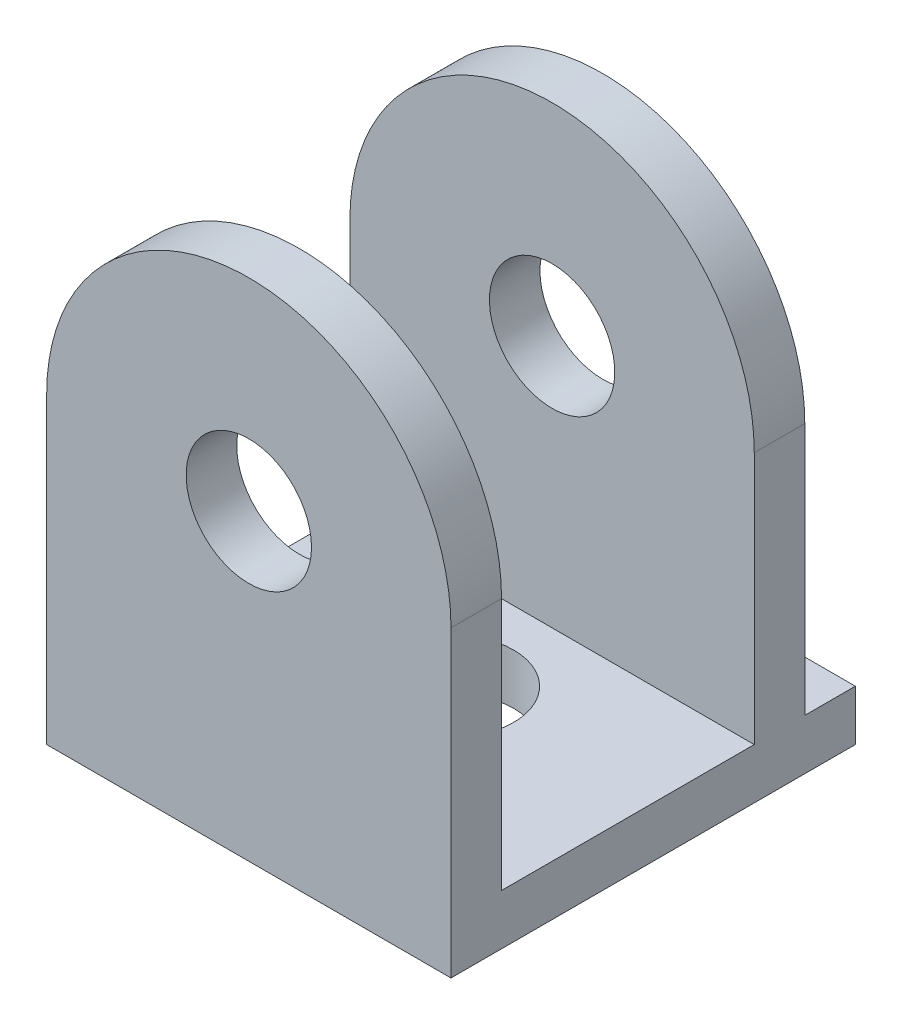
ISO-10303-21;
HEADER;
FILE_DESCRIPTION(('STEP AP214'),'2;1');
FILE_NAME('part.step','',(''),(''),'','','');
FILE_SCHEMA(('AUTOMOTIVE_DESIGN { 1 0 10303 214 1 1 1 1 }'));
ENDSEC;
DATA;
#1=APPLICATION_CONTEXT('core data for automotive mechanical design processes');
#2=APPLICATION_PROTOCOL_DEFINITION('international standard','automotive_design',2000,#1);
#3=PRODUCT_CONTEXT('',#1,'mechanical');
#4=PRODUCT('Part','Part','',(#3));
#5=PRODUCT_RELATED_PRODUCT_CATEGORY('part','',(#4));
#6=PRODUCT_DEFINITION_FORMATION('','',#4);
#7=PRODUCT_DEFINITION_CONTEXT('part definition',#1,'design');
#8=PRODUCT_DEFINITION('design','',#6,#7);
#9=PRODUCT_DEFINITION_SHAPE('','',#8);
#10=(LENGTH_UNIT() NAMED_UNIT(*) SI_UNIT(.MILLI.,.METRE.));
#11=(NAMED_UNIT(*) PLANE_ANGLE_UNIT() SI_UNIT($,.RADIAN.));
#12=(NAMED_UNIT(*) SI_UNIT($,.STERADIAN.) SOLID_ANGLE_UNIT());
#13=UNCERTAINTY_MEASURE_WITH_UNIT(LENGTH_MEASURE(1.E-05),#10,'distance_accuracy_value','');
#14=(GEOMETRIC_REPRESENTATION_CONTEXT(3) GLOBAL_UNCERTAINTY_ASSIGNED_CONTEXT((#13)) GLOBAL_UNIT_ASSIGNED_CONTEXT((#10,
#11,#12)) REPRESENTATION_CONTEXT('',''));
#15=CARTESIAN_POINT('',(0.,0.,0.));
#16=DIRECTION('',(0.,0.,1.));
#17=DIRECTION('',(1.,0.,0.));
#18=AXIS2_PLACEMENT_3D('',#15,#16,#17);
#19=CARTESIAN_POINT('',(0.,15.,10.));
#20=DIRECTION('',(0.,0.,-1.));
#21=DIRECTION('',(-1.,0.,0.));
#22=AXIS2_PLACEMENT_3D('',#19,#20,#21);
#23=CYLINDRICAL_SURFACE('',#22,10.);
#24=CARTESIAN_POINT('',(0.,15.,7.5));
#25=DIRECTION('',(0.,0.,1.));
#26=DIRECTION('',(0.,-1.,0.));
#27=AXIS2_PLACEMENT_3D('',#24,#25,#26);
#28=CIRCLE('',#27,10.);
#29=CARTESIAN_POINT('',(-10.,15.,7.5));
#30=VERTEX_POINT('',#29);
#31=CARTESIAN_POINT('',(10.,15.,7.5));
#32=VERTEX_POINT('',#31);
#33=EDGE_CURVE('E166',#30,#32,#28,.F.);
#34=ORIENTED_EDGE('',*,*,#33,.F.);
#35=DIRECTION('',(0.,0.,-1.));
#36=VECTOR('',#35,1.);
#37=CARTESIAN_POINT('',(-10.,15.,10.));
#38=LINE('',#37,#36);
#39=CARTESIAN_POINT('',(-10.,15.,10.));
#40=VERTEX_POINT('',#39);
#41=EDGE_CURVE('E49',#40,#30,#38,.T.);
#42=ORIENTED_EDGE('',*,*,#41,.F.);
#43=CARTESIAN_POINT('',(0.,15.,10.));
#44=DIRECTION('',(0.,0.,1.));
#45=DIRECTION('',(1.,0.,0.));
#46=AXIS2_PLACEMENT_3D('',#43,#44,#45);
#47=CIRCLE('',#46,10.);
#48=CARTESIAN_POINT('',(10.,15.,10.));
#49=VERTEX_POINT('',#48);
#50=EDGE_CURVE('E171',#40,#49,#47,.F.);
#51=ORIENTED_EDGE('',*,*,#50,.T.);
#52=DIRECTION('',(0.,0.,-1.));
#53=VECTOR('',#52,1.);
#54=CARTESIAN_POINT('',(10.,15.,10.));
#55=LINE('',#54,#53);
#56=EDGE_CURVE('E190',#49,#32,#55,.T.);
#57=ORIENTED_EDGE('',*,*,#56,.T.);
#58=EDGE_LOOP('',(#34,#42,#51,#57));
#59=FACE_BOUND('',#58,.T.);
#60=ADVANCED_FACE('F41',(#59),#23,.T.);
#61=CARTESIAN_POINT('',(0.,15.,-5.));
#62=DIRECTION('',(0.,0.,-1.));
#63=DIRECTION('',(0.,1.,0.));
#64=AXIS2_PLACEMENT_3D('',#61,#62,#63);
#65=CIRCLE('',#64,10.);
#66=CARTESIAN_POINT('',(10.,15.,-5.));
#67=VERTEX_POINT('',#66);
#68=CARTESIAN_POINT('',(-10.,15.,-5.));
#69=VERTEX_POINT('',#68);
#70=EDGE_CURVE('E168',#67,#69,#65,.F.);
#71=ORIENTED_EDGE('',*,*,#70,.F.);
#72=CARTESIAN_POINT('',(10.,15.,-7.50000000000001));
#73=VERTEX_POINT('',#72);
#74=EDGE_CURVE('E142',#67,#73,#55,.T.);
#75=ORIENTED_EDGE('',*,*,#74,.T.);
#76=CARTESIAN_POINT('',(0.,15.,-7.50000000000001));
#77=DIRECTION('',(0.,0.,1.));
#78=DIRECTION('',(0.,-1.,0.));
#79=AXIS2_PLACEMENT_3D('',#76,#77,#78);
#80=CIRCLE('',#79,10.);
#81=CARTESIAN_POINT('',(-10.,15.,-7.50000000000001));
#82=VERTEX_POINT('',#81);
#83=EDGE_CURVE('E126',#82,#73,#80,.F.);
#84=ORIENTED_EDGE('',*,*,#83,.F.);
#85=EDGE_CURVE('E198',#69,#82,#38,.T.);
#86=ORIENTED_EDGE('',*,*,#85,.F.);
#87=EDGE_LOOP('',(#71,#75,#84,#86));
#88=FACE_BOUND('',#87,.T.);
#89=ADVANCED_FACE('F43',(#88),#23,.T.);
#90=CARTESIAN_POINT('',(-10.,0.,10.));
#91=DIRECTION('',(1.,0.,0.));
#92=DIRECTION('',(0.,1.,0.));
#93=AXIS2_PLACEMENT_3D('',#90,#91,#92);
#94=PLANE('',#93);
#95=ORIENTED_EDGE('',*,*,#41,.T.);
#96=DIRECTION('',(0.,-1.,0.));
#97=VECTOR('',#96,1.);
#98=CARTESIAN_POINT('',(-10.,25.,7.5));
#99=LINE('',#98,#97);
#100=CARTESIAN_POINT('',(-10.,2.5,7.49999999999999));
#101=VERTEX_POINT('',#100);
#102=EDGE_CURVE('E145',#30,#101,#99,.T.);
#103=ORIENTED_EDGE('',*,*,#102,.T.);
#104=DIRECTION('',(0.,0.,-1.));
#105=VECTOR('',#104,1.);
#106=CARTESIAN_POINT('',(-10.,2.5,7.49999999999999));
#107=LINE('',#106,#105);
#108=CARTESIAN_POINT('',(-10.,2.5,-5.));
#109=VERTEX_POINT('',#108);
#110=EDGE_CURVE('E143',#101,#109,#107,.T.);
#111=ORIENTED_EDGE('',*,*,#110,.T.);
#112=DIRECTION('',(0.,1.,0.));
#113=VECTOR('',#112,1.);
#114=CARTESIAN_POINT('',(-10.,25.,-5.));
#115=LINE('',#114,#113);
#116=EDGE_CURVE('E130',#109,#69,#115,.T.);
#117=ORIENTED_EDGE('',*,*,#116,.T.);
#118=ORIENTED_EDGE('',*,*,#85,.T.);
#119=DIRECTION('',(0.,-1.,0.));
#120=VECTOR('',#119,1.);
#121=CARTESIAN_POINT('',(-10.,25.,-7.5));
#122=LINE('',#121,#120);
#123=CARTESIAN_POINT('',(-10.,2.49999999999999,-7.50000000000001));
#124=VERTEX_POINT('',#123);
#125=EDGE_CURVE('E158',#82,#124,#122,.T.);
#126=ORIENTED_EDGE('',*,*,#125,.T.);
#127=DIRECTION('',(0.,0.,-1.));
#128=VECTOR('',#127,1.);
#129=CARTESIAN_POINT('',(-10.,2.49999999999999,-10.));
#130=LINE('',#129,#128);
#131=CARTESIAN_POINT('',(-10.,2.49999999999999,-10.));
#132=VERTEX_POINT('',#131);
#133=EDGE_CURVE('E152',#124,#132,#130,.T.);
#134=ORIENTED_EDGE('',*,*,#133,.T.);
#135=DIRECTION('',(0.,-1.,0.));
#136=VECTOR('',#135,1.);
#137=CARTESIAN_POINT('',(-10.,0.,-10.));
#138=LINE('',#137,#136);
#139=CARTESIAN_POINT('',(-10.,0.,-10.));
#140=VERTEX_POINT('',#139);
#141=EDGE_CURVE('E167',#132,#140,#138,.T.);
#142=ORIENTED_EDGE('',*,*,#141,.T.);
#143=DIRECTION('',(0.,0.,-1.));
#144=VECTOR('',#143,1.);
#145=CARTESIAN_POINT('',(-10.,0.,10.));
#146=LINE('',#145,#144);
#147=CARTESIAN_POINT('',(-10.,0.,10.));
#148=VERTEX_POINT('',#147);
#149=EDGE_CURVE('E194',#148,#140,#146,.T.);
#150=ORIENTED_EDGE('',*,*,#149,.F.);
#151=DIRECTION('',(0.,-1.,0.));
#152=VECTOR('',#151,1.);
#153=CARTESIAN_POINT('',(-10.,0.,10.));
#154=LINE('',#153,#152);
#155=EDGE_CURVE('E172',#40,#148,#154,.T.);
#156=ORIENTED_EDGE('',*,*,#155,.F.);
#157=EDGE_LOOP('',(#95,#103,#111,#117,#118,#126,#134,#142,#150,#156));
#158=FACE_BOUND('',#157,.T.);
#159=ADVANCED_FACE('F234',(#158),#94,.F.);
#160=CARTESIAN_POINT('',(0.,0.,10.));
#161=DIRECTION('',(0.,1.,0.));
#162=DIRECTION('',(0.,0.,1.));
#163=AXIS2_PLACEMENT_3D('',#160,#161,#162);
#164=PLANE('',#163);
#165=CARTESIAN_POINT('',(0.,0.,0.));
#166=DIRECTION('',(0.,-1.,0.));
#167=DIRECTION('',(0.,0.,-1.));
#168=AXIS2_PLACEMENT_3D('',#165,#166,#167);
#169=CIRCLE('',#168,3.1);
#170=CARTESIAN_POINT('',(0.,0.,-3.1));
#171=VERTEX_POINT('',#170);
#172=EDGE_CURVE('E210',#171,#171,#169,.T.);
#173=ORIENTED_EDGE('',*,*,#172,.F.);
#174=EDGE_LOOP('',(#173));
#175=FACE_BOUND('',#174,.T.);
#176=DIRECTION('',(1.,0.,0.));
#177=VECTOR('',#176,1.);
#178=CARTESIAN_POINT('',(0.,0.,-10.));
#179=LINE('',#178,#177);
#180=CARTESIAN_POINT('',(10.,0.,-10.));
#181=VERTEX_POINT('',#180);
#182=EDGE_CURVE('E182',#140,#181,#179,.T.);
#183=ORIENTED_EDGE('',*,*,#182,.T.);
#184=DIRECTION('',(0.,0.,-1.));
#185=VECTOR('',#184,1.);
#186=CARTESIAN_POINT('',(10.,0.,10.));
#187=LINE('',#186,#185);
#188=CARTESIAN_POINT('',(10.,0.,10.));
#189=VERTEX_POINT('',#188);
#190=EDGE_CURVE('E188',#189,#181,#187,.T.);
#191=ORIENTED_EDGE('',*,*,#190,.F.);
#192=DIRECTION('',(1.,0.,0.));
#193=VECTOR('',#192,1.);
#194=CARTESIAN_POINT('',(0.,0.,10.));
#195=LINE('',#194,#193);
#196=EDGE_CURVE('E180',#148,#189,#195,.T.);
#197=ORIENTED_EDGE('',*,*,#196,.F.);
#198=ORIENTED_EDGE('',*,*,#149,.T.);
#199=EDGE_LOOP('',(#183,#191,#197,#198));
#200=FACE_BOUND('',#199,.T.);
#201=ADVANCED_FACE('F239',(#175,#200),#164,.F.);
#202=CARTESIAN_POINT('',(10.,0.,10.));
#203=DIRECTION('',(1.,0.,0.));
#204=DIRECTION('',(0.,1.,0.));
#205=AXIS2_PLACEMENT_3D('',#202,#203,#204);
#206=PLANE('',#205);
#207=DIRECTION('',(0.,-1.,0.));
#208=VECTOR('',#207,1.);
#209=CARTESIAN_POINT('',(10.,0.,7.49999999999999));
#210=LINE('',#209,#208);
#211=CARTESIAN_POINT('',(10.,2.5,7.49999999999999));
#212=VERTEX_POINT('',#211);
#213=EDGE_CURVE('E11',#32,#212,#210,.T.);
#214=ORIENTED_EDGE('',*,*,#213,.F.);
#215=ORIENTED_EDGE('',*,*,#56,.F.);
#216=DIRECTION('',(0.,-1.,0.));
#217=VECTOR('',#216,1.);
#218=CARTESIAN_POINT('',(10.,0.,10.));
#219=LINE('',#218,#217);
#220=EDGE_CURVE('E177',#49,#189,#219,.T.);
#221=ORIENTED_EDGE('',*,*,#220,.T.);
#222=ORIENTED_EDGE('',*,*,#190,.T.);
#223=DIRECTION('',(0.,-1.,0.));
#224=VECTOR('',#223,1.);
#225=CARTESIAN_POINT('',(10.,0.,-10.));
#226=LINE('',#225,#224);
#227=CARTESIAN_POINT('',(10.,2.49999999999999,-10.));
#228=VERTEX_POINT('',#227);
#229=EDGE_CURVE('E174',#228,#181,#226,.T.);
#230=ORIENTED_EDGE('',*,*,#229,.F.);
#231=DIRECTION('',(0.,0.,-1.));
#232=VECTOR('',#231,1.);
#233=CARTESIAN_POINT('',(10.,2.49999999999999,-10.));
#234=LINE('',#233,#232);
#235=CARTESIAN_POINT('',(10.,2.49999999999999,-7.50000000000001));
#236=VERTEX_POINT('',#235);
#237=EDGE_CURVE('E63',#236,#228,#234,.T.);
#238=ORIENTED_EDGE('',*,*,#237,.F.);
#239=DIRECTION('',(0.,-1.,0.));
#240=VECTOR('',#239,1.);
#241=CARTESIAN_POINT('',(10.,25.,-7.5));
#242=LINE('',#241,#240);
#243=EDGE_CURVE('E137',#73,#236,#242,.T.);
#244=ORIENTED_EDGE('',*,*,#243,.F.);
#245=ORIENTED_EDGE('',*,*,#74,.F.);
#246=DIRECTION('',(0.,1.,0.));
#247=VECTOR('',#246,1.);
#248=CARTESIAN_POINT('',(10.,25.,-5.));
#249=LINE('',#248,#247);
#250=CARTESIAN_POINT('',(10.,2.5,-5.));
#251=VERTEX_POINT('',#250);
#252=EDGE_CURVE('E121',#251,#67,#249,.T.);
#253=ORIENTED_EDGE('',*,*,#252,.F.);
#254=DIRECTION('',(0.,0.,-1.));
#255=VECTOR('',#254,1.);
#256=CARTESIAN_POINT('',(10.,2.5,7.49999999999999));
#257=LINE('',#256,#255);
#258=EDGE_CURVE('E135',#212,#251,#257,.T.);
#259=ORIENTED_EDGE('',*,*,#258,.F.);
#260=EDGE_LOOP('',(#214,#215,#221,#222,#230,#238,#244,#245,#253,#259));
#261=FACE_BOUND('',#260,.T.);
#262=ADVANCED_FACE('F139',(#261),#206,.T.);
#263=CARTESIAN_POINT('',(0.,0.,10.));
#264=DIRECTION('',(0.,0.,1.));
#265=DIRECTION('',(1.,0.,0.));
#266=AXIS2_PLACEMENT_3D('',#263,#264,#265);
#267=PLANE('',#266);
#268=CARTESIAN_POINT('',(0.,15.,10.));
#269=DIRECTION('',(0.,0.,1.));
#270=DIRECTION('',(1.,0.,0.));
#271=AXIS2_PLACEMENT_3D('',#268,#269,#270);
#272=CIRCLE('',#271,3.1);
#273=CARTESIAN_POINT('',(3.1,15.,10.));
#274=VERTEX_POINT('',#273);
#275=EDGE_CURVE('E160',#274,#274,#272,.T.);
#276=ORIENTED_EDGE('',*,*,#275,.F.);
#277=EDGE_LOOP('',(#276));
#278=FACE_BOUND('',#277,.T.);
#279=ORIENTED_EDGE('',*,*,#50,.F.);
#280=ORIENTED_EDGE('',*,*,#155,.T.);
#281=ORIENTED_EDGE('',*,*,#196,.T.);
#282=ORIENTED_EDGE('',*,*,#220,.F.);
#283=EDGE_LOOP('',(#279,#280,#281,#282));
#284=FACE_BOUND('',#283,.T.);
#285=ADVANCED_FACE('F225',(#278,#284),#267,.T.);
#286=CARTESIAN_POINT('',(0.,0.,-10.));
#287=DIRECTION('',(0.,0.,1.));
#288=DIRECTION('',(1.,0.,0.));
#289=AXIS2_PLACEMENT_3D('',#286,#287,#288);
#290=PLANE('',#289);
#291=ORIENTED_EDGE('',*,*,#141,.F.);
#292=DIRECTION('',(1.,0.,0.));
#293=VECTOR('',#292,1.);
#294=CARTESIAN_POINT('',(-10.,2.49999999999999,-10.));
#295=LINE('',#294,#293);
#296=EDGE_CURVE('E154',#132,#228,#295,.T.);
#297=ORIENTED_EDGE('',*,*,#296,.T.);
#298=ORIENTED_EDGE('',*,*,#229,.T.);
#299=ORIENTED_EDGE('',*,*,#182,.F.);
#300=EDGE_LOOP('',(#291,#297,#298,#299));
#301=FACE_BOUND('',#300,.T.);
#302=ADVANCED_FACE('F223',(#301),#290,.F.);
#303=CARTESIAN_POINT('',(-10.,2.49999999999999,-10.));
#304=DIRECTION('',(0.,-1.,0.));
#305=DIRECTION('',(0.,0.,-1.));
#306=AXIS2_PLACEMENT_3D('',#303,#304,#305);
#307=PLANE('',#306);
#308=ORIENTED_EDGE('',*,*,#296,.F.);
#309=ORIENTED_EDGE('',*,*,#133,.F.);
#310=DIRECTION('',(1.,0.,0.));
#311=VECTOR('',#310,1.);
#312=CARTESIAN_POINT('',(-10.,2.49999999999999,-7.50000000000001));
#313=LINE('',#312,#311);
#314=EDGE_CURVE('E155',#124,#236,#313,.T.);
#315=ORIENTED_EDGE('',*,*,#314,.T.);
#316=ORIENTED_EDGE('',*,*,#237,.T.);
#317=EDGE_LOOP('',(#308,#309,#315,#316));
#318=FACE_BOUND('',#317,.T.);
#319=ADVANCED_FACE('F255',(#318),#307,.F.);
#320=CARTESIAN_POINT('',(-10.,25.,-7.5));
#321=DIRECTION('',(0.,0.,1.));
#322=DIRECTION('',(0.,-1.,0.));
#323=AXIS2_PLACEMENT_3D('',#320,#321,#322);
#324=PLANE('',#323);
#325=CARTESIAN_POINT('',(0.,15.,-7.50000000000001));
#326=DIRECTION('',(0.,0.,1.));
#327=DIRECTION('',(0.,-1.,0.));
#328=AXIS2_PLACEMENT_3D('',#325,#326,#327);
#329=CIRCLE('',#328,3.1);
#330=CARTESIAN_POINT('',(0.,11.9,-7.50000000000001));
#331=VERTEX_POINT('',#330);
#332=EDGE_CURVE('E201',#331,#331,#329,.T.);
#333=ORIENTED_EDGE('',*,*,#332,.T.);
#334=EDGE_LOOP('',(#333));
#335=FACE_BOUND('',#334,.T.);
#336=ORIENTED_EDGE('',*,*,#83,.T.);
#337=ORIENTED_EDGE('',*,*,#243,.T.);
#338=ORIENTED_EDGE('',*,*,#314,.F.);
#339=ORIENTED_EDGE('',*,*,#125,.F.);
#340=EDGE_LOOP('',(#336,#337,#338,#339));
#341=FACE_BOUND('',#340,.T.);
#342=ADVANCED_FACE('F248',(#335,#341),#324,.F.);
#343=CARTESIAN_POINT('',(-10.,25.,7.5));
#344=DIRECTION('',(0.,0.,1.));
#345=DIRECTION('',(0.,-1.,0.));
#346=AXIS2_PLACEMENT_3D('',#343,#344,#345);
#347=PLANE('',#346);
#348=CARTESIAN_POINT('',(0.,15.,7.5));
#349=DIRECTION('',(0.,0.,1.));
#350=DIRECTION('',(0.,-1.,0.));
#351=AXIS2_PLACEMENT_3D('',#348,#349,#350);
#352=CIRCLE('',#351,3.1);
#353=CARTESIAN_POINT('',(0.,11.9,7.5));
#354=VERTEX_POINT('',#353);
#355=EDGE_CURVE('E199',#354,#354,#352,.T.);
#356=ORIENTED_EDGE('',*,*,#355,.T.);
#357=EDGE_LOOP('',(#356));
#358=FACE_BOUND('',#357,.T.);
#359=ORIENTED_EDGE('',*,*,#33,.T.);
#360=ORIENTED_EDGE('',*,*,#213,.T.);
#361=DIRECTION('',(1.,0.,0.));
#362=VECTOR('',#361,1.);
#363=CARTESIAN_POINT('',(-10.,2.5,7.49999999999999));
#364=LINE('',#363,#362);
#365=EDGE_CURVE('E59',#101,#212,#364,.T.);
#366=ORIENTED_EDGE('',*,*,#365,.F.);
#367=ORIENTED_EDGE('',*,*,#102,.F.);
#368=EDGE_LOOP('',(#359,#360,#366,#367));
#369=FACE_BOUND('',#368,.T.);
#370=ADVANCED_FACE('F243',(#358,#369),#347,.F.);
#371=CARTESIAN_POINT('',(-10.,25.,-5.));
#372=DIRECTION('',(0.,0.,-1.));
#373=DIRECTION('',(0.,1.,0.));
#374=AXIS2_PLACEMENT_3D('',#371,#372,#373);
#375=PLANE('',#374);
#376=CARTESIAN_POINT('',(0.,15.,-5.));
#377=DIRECTION('',(0.,0.,-1.));
#378=DIRECTION('',(0.,1.,0.));
#379=AXIS2_PLACEMENT_3D('',#376,#377,#378);
#380=CIRCLE('',#379,3.1);
#381=CARTESIAN_POINT('',(0.,18.1,-5.));
#382=VERTEX_POINT('',#381);
#383=EDGE_CURVE('E196',#382,#382,#380,.T.);
#384=ORIENTED_EDGE('',*,*,#383,.T.);
#385=EDGE_LOOP('',(#384));
#386=FACE_BOUND('',#385,.T.);
#387=ORIENTED_EDGE('',*,*,#70,.T.);
#388=ORIENTED_EDGE('',*,*,#116,.F.);
#389=DIRECTION('',(1.,0.,0.));
#390=VECTOR('',#389,1.);
#391=CARTESIAN_POINT('',(-10.,2.5,-5.));
#392=LINE('',#391,#390);
#393=EDGE_CURVE('E122',#109,#251,#392,.T.);
#394=ORIENTED_EDGE('',*,*,#393,.T.);
#395=ORIENTED_EDGE('',*,*,#252,.T.);
#396=EDGE_LOOP('',(#387,#388,#394,#395));
#397=FACE_BOUND('',#396,.T.);
#398=ADVANCED_FACE('F125',(#386,#397),#375,.F.);
#399=CARTESIAN_POINT('',(-10.,2.5,7.49999999999999));
#400=DIRECTION('',(0.,-1.,0.));
#401=DIRECTION('',(0.,0.,-1.));
#402=AXIS2_PLACEMENT_3D('',#399,#400,#401);
#403=PLANE('',#402);
#404=CARTESIAN_POINT('',(0.,2.5,0.));
#405=DIRECTION('',(0.,-1.,0.));
#406=DIRECTION('',(0.,0.,-1.));
#407=AXIS2_PLACEMENT_3D('',#404,#405,#406);
#408=CIRCLE('',#407,3.1);
#409=CARTESIAN_POINT('',(0.,2.5,-3.1));
#410=VERTEX_POINT('',#409);
#411=EDGE_CURVE('E44',#410,#410,#408,.T.);
#412=ORIENTED_EDGE('',*,*,#411,.T.);
#413=EDGE_LOOP('',(#412));
#414=FACE_BOUND('',#413,.T.);
#415=ORIENTED_EDGE('',*,*,#393,.F.);
#416=ORIENTED_EDGE('',*,*,#110,.F.);
#417=ORIENTED_EDGE('',*,*,#365,.T.);
#418=ORIENTED_EDGE('',*,*,#258,.T.);
#419=EDGE_LOOP('',(#415,#416,#417,#418));
#420=FACE_BOUND('',#419,.T.);
#421=ADVANCED_FACE('F131',(#414,#420),#403,.F.);
#422=CARTESIAN_POINT('',(0.,15.,-10.));
#423=DIRECTION('',(0.,0.,1.));
#424=DIRECTION('',(1.,0.,0.));
#425=AXIS2_PLACEMENT_3D('',#422,#423,#424);
#426=CYLINDRICAL_SURFACE('',#425,3.1);
#427=ORIENTED_EDGE('',*,*,#383,.F.);
#428=EDGE_LOOP('',(#427));
#429=FACE_BOUND('',#428,.T.);
#430=ORIENTED_EDGE('',*,*,#332,.F.);
#431=EDGE_LOOP('',(#430));
#432=FACE_BOUND('',#431,.T.);
#433=ADVANCED_FACE('F329',(#429,#432),#426,.F.);
#434=ORIENTED_EDGE('',*,*,#275,.T.);
#435=EDGE_LOOP('',(#434));
#436=FACE_BOUND('',#435,.T.);
#437=ORIENTED_EDGE('',*,*,#355,.F.);
#438=EDGE_LOOP('',(#437));
#439=FACE_BOUND('',#438,.T.);
#440=ADVANCED_FACE('F217',(#436,#439),#426,.F.);
#441=CARTESIAN_POINT('',(0.,25.,0.));
#442=DIRECTION('',(0.,-1.,0.));
#443=DIRECTION('',(0.,0.,-1.));
#444=AXIS2_PLACEMENT_3D('',#441,#442,#443);
#445=CYLINDRICAL_SURFACE('',#444,3.1);
#446=ORIENTED_EDGE('',*,*,#172,.T.);
#447=EDGE_LOOP('',(#446));
#448=FACE_BOUND('',#447,.T.);
#449=ORIENTED_EDGE('',*,*,#411,.F.);
#450=EDGE_LOOP('',(#449));
#451=FACE_BOUND('',#450,.T.);
#452=ADVANCED_FACE('F346',(#448,#451),#445,.F.);
#453=CLOSED_SHELL('',(#60,#89,#159,#201,#262,#285,#302,#319,#342,#370,#398,#421,#433,#440,#452));
#454=MANIFOLD_SOLID_BREP('B2',#453);
#455=ADVANCED_BREP_SHAPE_REPRESENTATION('',(#18,#454),#14);
#456=SHAPE_DEFINITION_REPRESENTATION(#9,#455);
ENDSEC;
END-ISO-10303-21;
